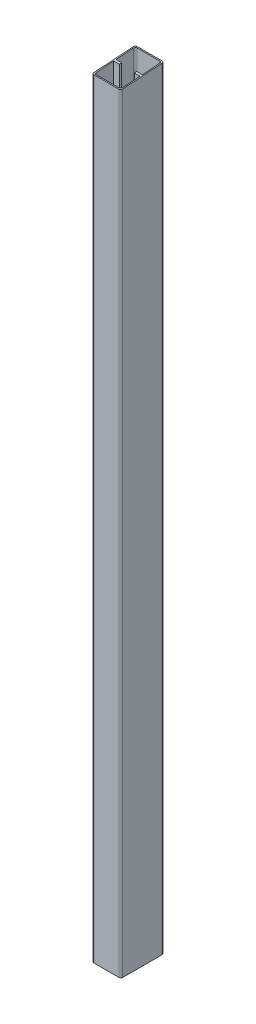
ISO-10303-21;
HEADER;
FILE_DESCRIPTION(('STEP AP214'),'2;1');
FILE_NAME('part.step','',(''),(''),'','','');
FILE_SCHEMA(('AUTOMOTIVE_DESIGN { 1 0 10303 214 1 1 1 1 }'));
ENDSEC;
DATA;
#1=APPLICATION_CONTEXT('core data for automotive mechanical design processes');
#2=APPLICATION_PROTOCOL_DEFINITION('international standard','automotive_design',2000,#1);
#3=PRODUCT_CONTEXT('',#1,'mechanical');
#4=PRODUCT('Part','Part','',(#3));
#5=PRODUCT_RELATED_PRODUCT_CATEGORY('part','',(#4));
#6=PRODUCT_DEFINITION_FORMATION('','',#4);
#7=PRODUCT_DEFINITION_CONTEXT('part definition',#1,'design');
#8=PRODUCT_DEFINITION('design','',#6,#7);
#9=PRODUCT_DEFINITION_SHAPE('','',#8);
#10=(LENGTH_UNIT() NAMED_UNIT(*) SI_UNIT(.MILLI.,.METRE.));
#11=(NAMED_UNIT(*) PLANE_ANGLE_UNIT() SI_UNIT($,.RADIAN.));
#12=(NAMED_UNIT(*) SI_UNIT($,.STERADIAN.) SOLID_ANGLE_UNIT());
#13=UNCERTAINTY_MEASURE_WITH_UNIT(LENGTH_MEASURE(1.E-05),#10,'distance_accuracy_value','');
#14=(GEOMETRIC_REPRESENTATION_CONTEXT(3) GLOBAL_UNCERTAINTY_ASSIGNED_CONTEXT((#13)) GLOBAL_UNIT_ASSIGNED_CONTEXT((#10,
#11,#12)) REPRESENTATION_CONTEXT('',''));
#15=CARTESIAN_POINT('',(0.,0.,0.));
#16=DIRECTION('',(0.,0.,1.));
#17=DIRECTION('',(1.,0.,0.));
#18=AXIS2_PLACEMENT_3D('',#15,#16,#17);
#19=CARTESIAN_POINT('',(-50.,2867.99923956296,75.));
#20=DIRECTION('',(0.,0.,-1.));
#21=DIRECTION('',(-1.,0.,0.));
#22=AXIS2_PLACEMENT_3D('',#19,#20,#21);
#23=PLANE('',#22);
#24=DIRECTION('',(1.,0.,0.));
#25=VECTOR('',#24,1.);
#26=CARTESIAN_POINT('',(-50.,0.,75.));
#27=LINE('',#26,#25);
#28=CARTESIAN_POINT('',(-44.,0.,75.));
#29=VERTEX_POINT('',#28);
#30=CARTESIAN_POINT('',(44.,0.,75.));
#31=VERTEX_POINT('',#30);
#32=EDGE_CURVE('E207',#29,#31,#27,.T.);
#33=ORIENTED_EDGE('',*,*,#32,.T.);
#34=DIRECTION('',(0.,-1.,0.));
#35=VECTOR('',#34,1.);
#36=CARTESIAN_POINT('',(44.,2867.99923956296,75.));
#37=LINE('',#36,#35);
#38=CARTESIAN_POINT('',(44.,2682.23684210526,75.));
#39=VERTEX_POINT('',#38);
#40=EDGE_CURVE('E283',#31,#39,#37,.F.);
#41=ORIENTED_EDGE('',*,*,#40,.T.);
#42=DIRECTION('',(1.,0.,0.));
#43=VECTOR('',#42,1.);
#44=CARTESIAN_POINT('',(-50.,2682.23684210526,75.));
#45=LINE('',#44,#43);
#46=CARTESIAN_POINT('',(-44.,2682.23684210526,75.));
#47=VERTEX_POINT('',#46);
#48=EDGE_CURVE('E340',#47,#39,#45,.T.);
#49=ORIENTED_EDGE('',*,*,#48,.F.);
#50=DIRECTION('',(0.,-1.,0.));
#51=VECTOR('',#50,1.);
#52=CARTESIAN_POINT('',(-44.,2867.99923956296,75.));
#53=LINE('',#52,#51);
#54=EDGE_CURVE('E280',#47,#29,#53,.T.);
#55=ORIENTED_EDGE('',*,*,#54,.T.);
#56=EDGE_LOOP('',(#33,#41,#49,#55));
#57=FACE_BOUND('',#56,.T.);
#58=ADVANCED_FACE('F33',(#57),#23,.F.);
#59=CARTESIAN_POINT('',(-50.,2867.99923956296,-75.));
#60=DIRECTION('',(1.,0.,0.));
#61=DIRECTION('',(0.,0.,-1.));
#62=AXIS2_PLACEMENT_3D('',#59,#60,#61);
#63=PLANE('',#62);
#64=DIRECTION('',(0.,-0.0700032814807309,0.997546761100416));
#65=VECTOR('',#64,1.);
#66=CARTESIAN_POINT('',(-50.,2693.62189520153,-87.2370066218541));
#67=LINE('',#66,#65);
#68=CARTESIAN_POINT('',(-50.,2692.34210526316,-68.9999999999999));
#69=VERTEX_POINT('',#68);
#70=CARTESIAN_POINT('',(-50.,2682.65789473684,69.));
#71=VERTEX_POINT('',#70);
#72=EDGE_CURVE('E342',#69,#71,#67,.T.);
#73=ORIENTED_EDGE('',*,*,#72,.F.);
#74=DIRECTION('',(0.,-1.,0.));
#75=VECTOR('',#74,1.);
#76=CARTESIAN_POINT('',(-50.,2867.99923956296,-69.));
#77=LINE('',#76,#75);
#78=CARTESIAN_POINT('',(-50.,0.,-69.));
#79=VERTEX_POINT('',#78);
#80=EDGE_CURVE('E253',#69,#79,#77,.T.);
#81=ORIENTED_EDGE('',*,*,#80,.T.);
#82=DIRECTION('',(0.,0.,1.));
#83=VECTOR('',#82,1.);
#84=CARTESIAN_POINT('',(-50.,0.,-75.));
#85=LINE('',#84,#83);
#86=CARTESIAN_POINT('',(-50.,0.,69.));
#87=VERTEX_POINT('',#86);
#88=EDGE_CURVE('E247',#79,#87,#85,.T.);
#89=ORIENTED_EDGE('',*,*,#88,.T.);
#90=DIRECTION('',(0.,-1.,0.));
#91=VECTOR('',#90,1.);
#92=CARTESIAN_POINT('',(-50.,2867.99923956296,69.));
#93=LINE('',#92,#91);
#94=EDGE_CURVE('E206',#87,#71,#93,.F.);
#95=ORIENTED_EDGE('',*,*,#94,.T.);
#96=EDGE_LOOP('',(#73,#81,#89,#95));
#97=FACE_BOUND('',#96,.T.);
#98=ADVANCED_FACE('F445',(#97),#63,.F.);
#99=CARTESIAN_POINT('',(-50.,2867.99923956296,-75.));
#100=DIRECTION('',(0.,0.,1.));
#101=DIRECTION('',(1.,0.,0.));
#102=AXIS2_PLACEMENT_3D('',#99,#100,#101);
#103=PLANE('',#102);
#104=DIRECTION('',(-1.,0.,0.));
#105=VECTOR('',#104,1.);
#106=CARTESIAN_POINT('',(-50.,0.,-75.));
#107=LINE('',#106,#105);
#108=CARTESIAN_POINT('',(44.,0.,-75.));
#109=VERTEX_POINT('',#108);
#110=CARTESIAN_POINT('',(-44.,0.,-75.));
#111=VERTEX_POINT('',#110);
#112=EDGE_CURVE('E244',#109,#111,#107,.T.);
#113=ORIENTED_EDGE('',*,*,#112,.T.);
#114=DIRECTION('',(0.,-1.,0.));
#115=VECTOR('',#114,1.);
#116=CARTESIAN_POINT('',(-44.,2867.99923956296,-75.));
#117=LINE('',#116,#115);
#118=CARTESIAN_POINT('',(-44.,2692.76315789474,-75.));
#119=VERTEX_POINT('',#118);
#120=EDGE_CURVE('E267',#111,#119,#117,.F.);
#121=ORIENTED_EDGE('',*,*,#120,.T.);
#122=DIRECTION('',(-1.,0.,0.));
#123=VECTOR('',#122,1.);
#124=CARTESIAN_POINT('',(-50.,2692.76315789474,-75.));
#125=LINE('',#124,#123);
#126=CARTESIAN_POINT('',(44.,2692.76315789474,-75.));
#127=VERTEX_POINT('',#126);
#128=EDGE_CURVE('E350',#127,#119,#125,.T.);
#129=ORIENTED_EDGE('',*,*,#128,.F.);
#130=DIRECTION('',(0.,-1.,0.));
#131=VECTOR('',#130,1.);
#132=CARTESIAN_POINT('',(44.,2867.99923956296,-75.));
#133=LINE('',#132,#131);
#134=EDGE_CURVE('E264',#127,#109,#133,.T.);
#135=ORIENTED_EDGE('',*,*,#134,.T.);
#136=EDGE_LOOP('',(#113,#121,#129,#135));
#137=FACE_BOUND('',#136,.T.);
#138=ADVANCED_FACE('F451',(#137),#103,.F.);
#139=CARTESIAN_POINT('',(50.,2867.99923956296,-75.));
#140=DIRECTION('',(-1.,0.,0.));
#141=DIRECTION('',(0.,0.,1.));
#142=AXIS2_PLACEMENT_3D('',#139,#140,#141);
#143=PLANE('',#142);
#144=DIRECTION('',(0.,0.0700032814807309,-0.997546761100416));
#145=VECTOR('',#144,1.);
#146=CARTESIAN_POINT('',(50.,2693.62189520153,-87.2370066218541));
#147=LINE('',#146,#145);
#148=CARTESIAN_POINT('',(50.,2682.65789473684,69.));
#149=VERTEX_POINT('',#148);
#150=CARTESIAN_POINT('',(50.,2692.34210526316,-68.9999999999999));
#151=VERTEX_POINT('',#150);
#152=EDGE_CURVE('E353',#149,#151,#147,.T.);
#153=ORIENTED_EDGE('',*,*,#152,.F.);
#154=DIRECTION('',(0.,-1.,0.));
#155=VECTOR('',#154,1.);
#156=CARTESIAN_POINT('',(50.,2867.99923956296,69.));
#157=LINE('',#156,#155);
#158=CARTESIAN_POINT('',(50.,0.,69.));
#159=VERTEX_POINT('',#158);
#160=EDGE_CURVE('E277',#149,#159,#157,.T.);
#161=ORIENTED_EDGE('',*,*,#160,.T.);
#162=DIRECTION('',(0.,0.,-1.));
#163=VECTOR('',#162,1.);
#164=CARTESIAN_POINT('',(50.,0.,-75.));
#165=LINE('',#164,#163);
#166=CARTESIAN_POINT('',(50.,0.,-69.));
#167=VERTEX_POINT('',#166);
#168=EDGE_CURVE('E242',#159,#167,#165,.T.);
#169=ORIENTED_EDGE('',*,*,#168,.T.);
#170=DIRECTION('',(0.,-1.,0.));
#171=VECTOR('',#170,1.);
#172=CARTESIAN_POINT('',(50.,2867.99923956296,-69.));
#173=LINE('',#172,#171);
#174=EDGE_CURVE('E48',#167,#151,#173,.F.);
#175=ORIENTED_EDGE('',*,*,#174,.T.);
#176=EDGE_LOOP('',(#153,#161,#169,#175));
#177=FACE_BOUND('',#176,.T.);
#178=ADVANCED_FACE('F459',(#177),#143,.F.);
#179=CARTESIAN_POINT('',(0.,0.,0.));
#180=DIRECTION('',(0.,1.,0.));
#181=DIRECTION('',(0.,0.,1.));
#182=AXIS2_PLACEMENT_3D('',#179,#180,#181);
#183=PLANE('',#182);
#184=ORIENTED_EDGE('',*,*,#88,.F.);
#185=CARTESIAN_POINT('',(-44.,0.,-69.));
#186=DIRECTION('',(0.,1.,0.));
#187=DIRECTION('',(0.,0.,1.));
#188=AXIS2_PLACEMENT_3D('',#185,#186,#187);
#189=CIRCLE('',#188,6.);
#190=EDGE_CURVE('E262',#79,#111,#189,.F.);
#191=ORIENTED_EDGE('',*,*,#190,.T.);
#192=ORIENTED_EDGE('',*,*,#112,.F.);
#193=CARTESIAN_POINT('',(44.,0.,-69.));
#194=DIRECTION('',(0.,1.,0.));
#195=DIRECTION('',(0.,0.,1.));
#196=AXIS2_PLACEMENT_3D('',#193,#194,#195);
#197=CIRCLE('',#196,6.);
#198=EDGE_CURVE('E258',#109,#167,#197,.F.);
#199=ORIENTED_EDGE('',*,*,#198,.T.);
#200=ORIENTED_EDGE('',*,*,#168,.F.);
#201=CARTESIAN_POINT('',(44.,0.,69.));
#202=DIRECTION('',(0.,1.,0.));
#203=DIRECTION('',(0.,0.,1.));
#204=AXIS2_PLACEMENT_3D('',#201,#202,#203);
#205=CIRCLE('',#204,6.);
#206=EDGE_CURVE('E260',#159,#31,#205,.F.);
#207=ORIENTED_EDGE('',*,*,#206,.T.);
#208=ORIENTED_EDGE('',*,*,#32,.F.);
#209=CARTESIAN_POINT('',(-44.,0.,69.));
#210=DIRECTION('',(0.,1.,0.));
#211=DIRECTION('',(0.,0.,1.));
#212=AXIS2_PLACEMENT_3D('',#209,#210,#211);
#213=CIRCLE('',#212,6.);
#214=EDGE_CURVE('E256',#29,#87,#213,.F.);
#215=ORIENTED_EDGE('',*,*,#214,.T.);
#216=EDGE_LOOP('',(#184,#191,#192,#199,#200,#207,#208,#215));
#217=FACE_BOUND('',#216,.T.);
#218=DIRECTION('',(0.,0.,-1.));
#219=VECTOR('',#218,1.);
#220=CARTESIAN_POINT('',(46.,0.,-71.));
#221=LINE('',#220,#219);
#222=CARTESIAN_POINT('',(46.,0.,-4.00000000000001));
#223=VERTEX_POINT('',#222);
#224=CARTESIAN_POINT('',(46.,0.,-65.));
#225=VERTEX_POINT('',#224);
#226=EDGE_CURVE('E220',#223,#225,#221,.T.);
#227=ORIENTED_EDGE('',*,*,#226,.T.);
#228=CARTESIAN_POINT('',(40.,0.,-65.));
#229=DIRECTION('',(0.,1.,0.));
#230=DIRECTION('',(0.,0.,1.));
#231=AXIS2_PLACEMENT_3D('',#228,#229,#230);
#232=CIRCLE('',#231,6.);
#233=CARTESIAN_POINT('',(40.,0.,-71.));
#234=VERTEX_POINT('',#233);
#235=EDGE_CURVE('E312',#225,#234,#232,.T.);
#236=ORIENTED_EDGE('',*,*,#235,.T.);
#237=DIRECTION('',(-1.,0.,0.));
#238=VECTOR('',#237,1.);
#239=CARTESIAN_POINT('',(-46.,0.,-71.));
#240=LINE('',#239,#238);
#241=CARTESIAN_POINT('',(-40.,0.,-71.));
#242=VERTEX_POINT('',#241);
#243=EDGE_CURVE('E321',#234,#242,#240,.T.);
#244=ORIENTED_EDGE('',*,*,#243,.T.);
#245=CARTESIAN_POINT('',(-40.,0.,-65.));
#246=DIRECTION('',(0.,1.,0.));
#247=DIRECTION('',(0.,0.,1.));
#248=AXIS2_PLACEMENT_3D('',#245,#246,#247);
#249=CIRCLE('',#248,6.);
#250=CARTESIAN_POINT('',(-46.,0.,-65.));
#251=VERTEX_POINT('',#250);
#252=EDGE_CURVE('E41',#242,#251,#249,.T.);
#253=ORIENTED_EDGE('',*,*,#252,.T.);
#254=DIRECTION('',(0.,0.,1.));
#255=VECTOR('',#254,1.);
#256=CARTESIAN_POINT('',(-46.,0.,-71.));
#257=LINE('',#256,#255);
#258=CARTESIAN_POINT('',(-46.,0.,-4.));
#259=VERTEX_POINT('',#258);
#260=EDGE_CURVE('E319',#251,#259,#257,.T.);
#261=ORIENTED_EDGE('',*,*,#260,.T.);
#262=DIRECTION('',(1.,0.,0.));
#263=VECTOR('',#262,1.);
#264=CARTESIAN_POINT('',(-46.,0.,-4.));
#265=LINE('',#264,#263);
#266=CARTESIAN_POINT('',(-26.,0.,-4.));
#267=VERTEX_POINT('',#266);
#268=EDGE_CURVE('E330',#259,#267,#265,.T.);
#269=ORIENTED_EDGE('',*,*,#268,.T.);
#270=DIRECTION('',(0.,0.,1.));
#271=VECTOR('',#270,1.);
#272=CARTESIAN_POINT('',(-26.,0.,-4.));
#273=LINE('',#272,#271);
#274=CARTESIAN_POINT('',(-26.,0.,4.));
#275=VERTEX_POINT('',#274);
#276=EDGE_CURVE('E357',#267,#275,#273,.T.);
#277=ORIENTED_EDGE('',*,*,#276,.T.);
#278=DIRECTION('',(-1.,0.,0.));
#279=VECTOR('',#278,1.);
#280=CARTESIAN_POINT('',(-46.,0.,4.));
#281=LINE('',#280,#279);
#282=CARTESIAN_POINT('',(-46.,0.,4.));
#283=VERTEX_POINT('',#282);
#284=EDGE_CURVE('E360',#275,#283,#281,.T.);
#285=ORIENTED_EDGE('',*,*,#284,.T.);
#286=DIRECTION('',(0.,0.,1.));
#287=VECTOR('',#286,1.);
#288=CARTESIAN_POINT('',(-46.,0.,4.));
#289=LINE('',#288,#287);
#290=CARTESIAN_POINT('',(-46.,0.,65.));
#291=VERTEX_POINT('',#290);
#292=EDGE_CURVE('E363',#283,#291,#289,.T.);
#293=ORIENTED_EDGE('',*,*,#292,.T.);
#294=CARTESIAN_POINT('',(-40.,0.,65.));
#295=DIRECTION('',(0.,1.,0.));
#296=DIRECTION('',(0.,0.,1.));
#297=AXIS2_PLACEMENT_3D('',#294,#295,#296);
#298=CIRCLE('',#297,6.);
#299=CARTESIAN_POINT('',(-40.,0.,71.));
#300=VERTEX_POINT('',#299);
#301=EDGE_CURVE('E308',#291,#300,#298,.T.);
#302=ORIENTED_EDGE('',*,*,#301,.T.);
#303=DIRECTION('',(1.,0.,0.));
#304=VECTOR('',#303,1.);
#305=CARTESIAN_POINT('',(-46.,0.,71.));
#306=LINE('',#305,#304);
#307=CARTESIAN_POINT('',(40.0000000000001,0.,71.));
#308=VERTEX_POINT('',#307);
#309=EDGE_CURVE('E366',#300,#308,#306,.T.);
#310=ORIENTED_EDGE('',*,*,#309,.T.);
#311=CARTESIAN_POINT('',(40.0000000000001,0.,65.));
#312=DIRECTION('',(0.,1.,0.));
#313=DIRECTION('',(0.,0.,1.));
#314=AXIS2_PLACEMENT_3D('',#311,#312,#313);
#315=CIRCLE('',#314,6.);
#316=CARTESIAN_POINT('',(46.,0.,65.));
#317=VERTEX_POINT('',#316);
#318=EDGE_CURVE('E304',#308,#317,#315,.T.);
#319=ORIENTED_EDGE('',*,*,#318,.T.);
#320=DIRECTION('',(0.,0.,-1.));
#321=VECTOR('',#320,1.);
#322=CARTESIAN_POINT('',(46.,0.,3.99999999999999));
#323=LINE('',#322,#321);
#324=CARTESIAN_POINT('',(46.,0.,3.99999999999999));
#325=VERTEX_POINT('',#324);
#326=EDGE_CURVE('E369',#317,#325,#323,.T.);
#327=ORIENTED_EDGE('',*,*,#326,.T.);
#328=DIRECTION('',(-1.,0.,0.));
#329=VECTOR('',#328,1.);
#330=CARTESIAN_POINT('',(46.,0.,3.99999999999999));
#331=LINE('',#330,#329);
#332=CARTESIAN_POINT('',(26.,0.,4.));
#333=VERTEX_POINT('',#332);
#334=EDGE_CURVE('E371',#325,#333,#331,.T.);
#335=ORIENTED_EDGE('',*,*,#334,.T.);
#336=DIRECTION('',(0.,0.,-1.));
#337=VECTOR('',#336,1.);
#338=CARTESIAN_POINT('',(26.,0.,-4.));
#339=LINE('',#338,#337);
#340=CARTESIAN_POINT('',(26.,0.,-4.));
#341=VERTEX_POINT('',#340);
#342=EDGE_CURVE('E374',#333,#341,#339,.T.);
#343=ORIENTED_EDGE('',*,*,#342,.T.);
#344=DIRECTION('',(1.,0.,0.));
#345=VECTOR('',#344,1.);
#346=CARTESIAN_POINT('',(46.,0.,-4.00000000000001));
#347=LINE('',#346,#345);
#348=EDGE_CURVE('E225',#341,#223,#347,.T.);
#349=ORIENTED_EDGE('',*,*,#348,.T.);
#350=EDGE_LOOP('',(#227,#236,#244,#253,#261,#269,#277,#285,#293,#302,#310,#319,#327,#335,#343,#349));
#351=FACE_BOUND('',#350,.T.);
#352=ADVANCED_FACE('F317',(#217,#351),#183,.F.);
#353=CARTESIAN_POINT('',(46.,2867.99923956296,-71.));
#354=DIRECTION('',(-1.,0.,0.));
#355=DIRECTION('',(0.,0.,1.));
#356=AXIS2_PLACEMENT_3D('',#353,#354,#355);
#357=PLANE('',#356);
#358=DIRECTION('',(0.,0.0700032814807309,-0.997546761100416));
#359=VECTOR('',#358,1.);
#360=CARTESIAN_POINT('',(46.,2693.3425690147,-83.2566084595264));
#361=LINE('',#360,#359);
#362=CARTESIAN_POINT('',(46.,2687.78070175439,-4.));
#363=VERTEX_POINT('',#362);
#364=CARTESIAN_POINT('',(46.,2692.06140350877,-65.));
#365=VERTEX_POINT('',#364);
#366=EDGE_CURVE('E194',#363,#365,#361,.T.);
#367=ORIENTED_EDGE('',*,*,#366,.T.);
#368=DIRECTION('',(0.,-1.,0.));
#369=VECTOR('',#368,1.);
#370=CARTESIAN_POINT('',(46.,0.,-65.));
#371=LINE('',#370,#369);
#372=EDGE_CURVE('E295',#365,#225,#371,.T.);
#373=ORIENTED_EDGE('',*,*,#372,.T.);
#374=ORIENTED_EDGE('',*,*,#226,.F.);
#375=DIRECTION('',(0.,-1.,0.));
#376=VECTOR('',#375,1.);
#377=CARTESIAN_POINT('',(46.,2867.99923956296,-4.00000000000001));
#378=LINE('',#377,#376);
#379=EDGE_CURVE('E212',#363,#223,#378,.T.);
#380=ORIENTED_EDGE('',*,*,#379,.F.);
#381=EDGE_LOOP('',(#367,#373,#374,#380));
#382=FACE_BOUND('',#381,.T.);
#383=ADVANCED_FACE('F218',(#382),#357,.T.);
#384=CARTESIAN_POINT('',(46.,2867.99923956296,-4.00000000000001));
#385=DIRECTION('',(0.,0.,-1.));
#386=DIRECTION('',(-1.,0.,0.));
#387=AXIS2_PLACEMENT_3D('',#384,#385,#386);
#388=PLANE('',#387);
#389=DIRECTION('',(0.,-1.,0.));
#390=VECTOR('',#389,1.);
#391=CARTESIAN_POINT('',(26.,2867.99923956296,-4.));
#392=LINE('',#391,#390);
#393=CARTESIAN_POINT('',(26.,2687.78070175439,-4.));
#394=VERTEX_POINT('',#393);
#395=EDGE_CURVE('E214',#394,#341,#392,.T.);
#396=ORIENTED_EDGE('',*,*,#395,.F.);
#397=DIRECTION('',(1.,0.,0.));
#398=VECTOR('',#397,1.);
#399=CARTESIAN_POINT('',(46.,2687.78070175439,-4.00000000000001));
#400=LINE('',#399,#398);
#401=EDGE_CURVE('E198',#394,#363,#400,.T.);
#402=ORIENTED_EDGE('',*,*,#401,.T.);
#403=ORIENTED_EDGE('',*,*,#379,.T.);
#404=ORIENTED_EDGE('',*,*,#348,.F.);
#405=EDGE_LOOP('',(#396,#402,#403,#404));
#406=FACE_BOUND('',#405,.T.);
#407=ADVANCED_FACE('F210',(#406),#388,.T.);
#408=CARTESIAN_POINT('',(26.,2867.99923956296,-4.));
#409=DIRECTION('',(-1.,0.,0.));
#410=DIRECTION('',(0.,0.,1.));
#411=AXIS2_PLACEMENT_3D('',#408,#409,#410);
#412=PLANE('',#411);
#413=DIRECTION('',(0.,-1.,0.));
#414=VECTOR('',#413,1.);
#415=CARTESIAN_POINT('',(26.,2867.99923956296,4.));
#416=LINE('',#415,#414);
#417=CARTESIAN_POINT('',(26.,2687.21929824561,4.));
#418=VERTEX_POINT('',#417);
#419=EDGE_CURVE('E223',#418,#333,#416,.T.);
#420=ORIENTED_EDGE('',*,*,#419,.F.);
#421=DIRECTION('',(0.,0.0700032814807309,-0.997546761100416));
#422=VECTOR('',#421,1.);
#423=CARTESIAN_POINT('',(26.,2688.6638553853,-16.5849392405372));
#424=LINE('',#423,#422);
#425=EDGE_CURVE('E216',#418,#394,#424,.T.);
#426=ORIENTED_EDGE('',*,*,#425,.T.);
#427=ORIENTED_EDGE('',*,*,#395,.T.);
#428=ORIENTED_EDGE('',*,*,#342,.F.);
#429=EDGE_LOOP('',(#420,#426,#427,#428));
#430=FACE_BOUND('',#429,.T.);
#431=ADVANCED_FACE('F380',(#430),#412,.T.);
#432=CARTESIAN_POINT('',(46.,2867.99923956296,3.99999999999999));
#433=DIRECTION('',(0.,0.,1.));
#434=DIRECTION('',(1.,0.,0.));
#435=AXIS2_PLACEMENT_3D('',#432,#433,#434);
#436=PLANE('',#435);
#437=DIRECTION('',(0.,-1.,0.));
#438=VECTOR('',#437,1.);
#439=CARTESIAN_POINT('',(46.,2867.99923956296,3.99999999999999));
#440=LINE('',#439,#438);
#441=CARTESIAN_POINT('',(46.,2687.21929824561,3.99999999999999));
#442=VERTEX_POINT('',#441);
#443=EDGE_CURVE('E230',#442,#325,#440,.T.);
#444=ORIENTED_EDGE('',*,*,#443,.F.);
#445=DIRECTION('',(-1.,0.,0.));
#446=VECTOR('',#445,1.);
#447=CARTESIAN_POINT('',(46.,2687.21929824561,3.99999999999999));
#448=LINE('',#447,#446);
#449=EDGE_CURVE('E383',#442,#418,#448,.T.);
#450=ORIENTED_EDGE('',*,*,#449,.T.);
#451=ORIENTED_EDGE('',*,*,#419,.T.);
#452=ORIENTED_EDGE('',*,*,#334,.F.);
#453=EDGE_LOOP('',(#444,#450,#451,#452));
#454=FACE_BOUND('',#453,.T.);
#455=ADVANCED_FACE('F435',(#454),#436,.T.);
#456=CARTESIAN_POINT('',(46.,2867.99923956296,3.99999999999999));
#457=DIRECTION('',(-1.,0.,0.));
#458=DIRECTION('',(0.,0.,1.));
#459=AXIS2_PLACEMENT_3D('',#456,#457,#458);
#460=PLANE('',#459);
#461=ORIENTED_EDGE('',*,*,#326,.F.);
#462=DIRECTION('',(0.,-1.,0.));
#463=VECTOR('',#462,1.);
#464=CARTESIAN_POINT('',(46.,2682.51754385965,65.));
#465=LINE('',#464,#463);
#466=CARTESIAN_POINT('',(46.,2682.93859649123,65.));
#467=VERTEX_POINT('',#466);
#468=EDGE_CURVE('E290',#317,#467,#465,.F.);
#469=ORIENTED_EDGE('',*,*,#468,.T.);
#470=DIRECTION('',(0.,0.0700032814807309,-0.997546761100416));
#471=VECTOR('',#470,1.);
#472=CARTESIAN_POINT('',(46.,2688.10520301164,-8.62414291588173));
#473=LINE('',#472,#471);
#474=EDGE_CURVE('E385',#467,#442,#473,.T.);
#475=ORIENTED_EDGE('',*,*,#474,.T.);
#476=ORIENTED_EDGE('',*,*,#443,.T.);
#477=EDGE_LOOP('',(#461,#469,#475,#476));
#478=FACE_BOUND('',#477,.T.);
#479=ADVANCED_FACE('F431',(#478),#460,.T.);
#480=CARTESIAN_POINT('',(-46.,2867.99923956296,71.));
#481=DIRECTION('',(0.,0.,-1.));
#482=DIRECTION('',(-1.,0.,0.));
#483=AXIS2_PLACEMENT_3D('',#480,#481,#482);
#484=PLANE('',#483);
#485=DIRECTION('',(1.,0.,0.));
#486=VECTOR('',#485,1.);
#487=CARTESIAN_POINT('',(-46.,2682.51754385965,71.));
#488=LINE('',#487,#486);
#489=CARTESIAN_POINT('',(-40.,2682.51754385965,71.));
#490=VERTEX_POINT('',#489);
#491=CARTESIAN_POINT('',(40.0000000000001,2682.51754385965,71.));
#492=VERTEX_POINT('',#491);
#493=EDGE_CURVE('E389',#490,#492,#488,.T.);
#494=ORIENTED_EDGE('',*,*,#493,.T.);
#495=DIRECTION('',(0.,-1.,0.));
#496=VECTOR('',#495,1.);
#497=CARTESIAN_POINT('',(40.0000000000001,0.,71.));
#498=LINE('',#497,#496);
#499=EDGE_CURVE('E287',#492,#308,#498,.T.);
#500=ORIENTED_EDGE('',*,*,#499,.T.);
#501=ORIENTED_EDGE('',*,*,#309,.F.);
#502=DIRECTION('',(0.,-1.,0.));
#503=VECTOR('',#502,1.);
#504=CARTESIAN_POINT('',(-40.,2682.51754385965,71.));
#505=LINE('',#504,#503);
#506=EDGE_CURVE('E285',#300,#490,#505,.F.);
#507=ORIENTED_EDGE('',*,*,#506,.T.);
#508=EDGE_LOOP('',(#494,#500,#501,#507));
#509=FACE_BOUND('',#508,.T.);
#510=ADVANCED_FACE('F422',(#509),#484,.T.);
#511=CARTESIAN_POINT('',(-46.,2867.99923956296,4.));
#512=DIRECTION('',(1.,0.,0.));
#513=DIRECTION('',(0.,0.,-1.));
#514=AXIS2_PLACEMENT_3D('',#511,#512,#513);
#515=PLANE('',#514);
#516=DIRECTION('',(0.,-0.0700032814807309,0.997546761100416));
#517=VECTOR('',#516,1.);
#518=CARTESIAN_POINT('',(-46.,2688.10520301164,-8.62414291588172));
#519=LINE('',#518,#517);
#520=CARTESIAN_POINT('',(-46.,2687.21929824561,4.));
#521=VERTEX_POINT('',#520);
#522=CARTESIAN_POINT('',(-46.,2682.93859649123,65.));
#523=VERTEX_POINT('',#522);
#524=EDGE_CURVE('E392',#521,#523,#519,.T.);
#525=ORIENTED_EDGE('',*,*,#524,.T.);
#526=DIRECTION('',(0.,-1.,0.));
#527=VECTOR('',#526,1.);
#528=CARTESIAN_POINT('',(-46.,0.,65.));
#529=LINE('',#528,#527);
#530=EDGE_CURVE('E292',#523,#291,#529,.T.);
#531=ORIENTED_EDGE('',*,*,#530,.T.);
#532=ORIENTED_EDGE('',*,*,#292,.F.);
#533=DIRECTION('',(0.,-1.,0.));
#534=VECTOR('',#533,1.);
#535=CARTESIAN_POINT('',(-46.,2867.99923956296,4.));
#536=LINE('',#535,#534);
#537=EDGE_CURVE('E233',#521,#283,#536,.T.);
#538=ORIENTED_EDGE('',*,*,#537,.F.);
#539=EDGE_LOOP('',(#525,#531,#532,#538));
#540=FACE_BOUND('',#539,.T.);
#541=ADVANCED_FACE('F414',(#540),#515,.T.);
#542=CARTESIAN_POINT('',(-46.,2867.99923956296,4.));
#543=DIRECTION('',(0.,0.,1.));
#544=DIRECTION('',(1.,0.,0.));
#545=AXIS2_PLACEMENT_3D('',#542,#543,#544);
#546=PLANE('',#545);
#547=DIRECTION('',(0.,-1.,0.));
#548=VECTOR('',#547,1.);
#549=CARTESIAN_POINT('',(-26.,2867.99923956296,4.));
#550=LINE('',#549,#548);
#551=CARTESIAN_POINT('',(-26.,2687.21929824561,4.));
#552=VERTEX_POINT('',#551);
#553=EDGE_CURVE('E235',#552,#275,#550,.T.);
#554=ORIENTED_EDGE('',*,*,#553,.F.);
#555=DIRECTION('',(-1.,0.,0.));
#556=VECTOR('',#555,1.);
#557=CARTESIAN_POINT('',(-46.,2687.21929824561,4.));
#558=LINE('',#557,#556);
#559=EDGE_CURVE('E395',#552,#521,#558,.T.);
#560=ORIENTED_EDGE('',*,*,#559,.T.);
#561=ORIENTED_EDGE('',*,*,#537,.T.);
#562=ORIENTED_EDGE('',*,*,#284,.F.);
#563=EDGE_LOOP('',(#554,#560,#561,#562));
#564=FACE_BOUND('',#563,.T.);
#565=ADVANCED_FACE('F411',(#564),#546,.T.);
#566=CARTESIAN_POINT('',(-26.,2867.99923956296,-4.));
#567=DIRECTION('',(1.,0.,0.));
#568=DIRECTION('',(0.,0.,-1.));
#569=AXIS2_PLACEMENT_3D('',#566,#567,#568);
#570=PLANE('',#569);
#571=DIRECTION('',(0.,-1.,0.));
#572=VECTOR('',#571,1.);
#573=CARTESIAN_POINT('',(-26.,2867.99923956296,-4.));
#574=LINE('',#573,#572);
#575=CARTESIAN_POINT('',(-26.,2687.78070175439,-4.));
#576=VERTEX_POINT('',#575);
#577=EDGE_CURVE('E237',#576,#267,#574,.T.);
#578=ORIENTED_EDGE('',*,*,#577,.F.);
#579=DIRECTION('',(0.,-0.0700032814807309,0.997546761100416));
#580=VECTOR('',#579,1.);
#581=CARTESIAN_POINT('',(-26.,2688.6638553853,-16.5849392405372));
#582=LINE('',#581,#580);
#583=EDGE_CURVE('E398',#576,#552,#582,.T.);
#584=ORIENTED_EDGE('',*,*,#583,.T.);
#585=ORIENTED_EDGE('',*,*,#553,.T.);
#586=ORIENTED_EDGE('',*,*,#276,.F.);
#587=EDGE_LOOP('',(#578,#584,#585,#586));
#588=FACE_BOUND('',#587,.T.);
#589=ADVANCED_FACE('F407',(#588),#570,.T.);
#590=CARTESIAN_POINT('',(-46.,2867.99923956296,-4.));
#591=DIRECTION('',(0.,0.,-1.));
#592=DIRECTION('',(-1.,0.,0.));
#593=AXIS2_PLACEMENT_3D('',#590,#591,#592);
#594=PLANE('',#593);
#595=DIRECTION('',(0.,-1.,0.));
#596=VECTOR('',#595,1.);
#597=CARTESIAN_POINT('',(-46.,2867.99923956296,-4.));
#598=LINE('',#597,#596);
#599=CARTESIAN_POINT('',(-46.,2687.78070175439,-4.));
#600=VERTEX_POINT('',#599);
#601=EDGE_CURVE('E239',#600,#259,#598,.T.);
#602=ORIENTED_EDGE('',*,*,#601,.F.);
#603=DIRECTION('',(1.,0.,0.));
#604=VECTOR('',#603,1.);
#605=CARTESIAN_POINT('',(-46.,2687.78070175439,-4.));
#606=LINE('',#605,#604);
#607=EDGE_CURVE('E344',#600,#576,#606,.T.);
#608=ORIENTED_EDGE('',*,*,#607,.T.);
#609=ORIENTED_EDGE('',*,*,#577,.T.);
#610=ORIENTED_EDGE('',*,*,#268,.F.);
#611=EDGE_LOOP('',(#602,#608,#609,#610));
#612=FACE_BOUND('',#611,.T.);
#613=ADVANCED_FACE('F402',(#612),#594,.T.);
#614=CARTESIAN_POINT('',(-46.,2867.99923956296,-71.));
#615=DIRECTION('',(1.,0.,0.));
#616=DIRECTION('',(0.,0.,-1.));
#617=AXIS2_PLACEMENT_3D('',#614,#615,#616);
#618=PLANE('',#617);
#619=ORIENTED_EDGE('',*,*,#260,.F.);
#620=DIRECTION('',(0.,-1.,0.));
#621=VECTOR('',#620,1.);
#622=CARTESIAN_POINT('',(-46.,2692.48245614035,-65.));
#623=LINE('',#622,#621);
#624=CARTESIAN_POINT('',(-46.,2692.06140350877,-65.));
#625=VERTEX_POINT('',#624);
#626=EDGE_CURVE('E302',#251,#625,#623,.F.);
#627=ORIENTED_EDGE('',*,*,#626,.T.);
#628=DIRECTION('',(0.,-0.0700032814807309,0.997546761100416));
#629=VECTOR('',#628,1.);
#630=CARTESIAN_POINT('',(-46.,2693.3425690147,-83.2566084595264));
#631=LINE('',#630,#629);
#632=EDGE_CURVE('E336',#625,#600,#631,.T.);
#633=ORIENTED_EDGE('',*,*,#632,.T.);
#634=ORIENTED_EDGE('',*,*,#601,.T.);
#635=EDGE_LOOP('',(#619,#627,#633,#634));
#636=FACE_BOUND('',#635,.T.);
#637=ADVANCED_FACE('F326',(#636),#618,.T.);
#638=CARTESIAN_POINT('',(-46.,2867.99923956296,-71.));
#639=DIRECTION('',(0.,0.,1.));
#640=DIRECTION('',(1.,0.,0.));
#641=AXIS2_PLACEMENT_3D('',#638,#639,#640);
#642=PLANE('',#641);
#643=ORIENTED_EDGE('',*,*,#243,.F.);
#644=DIRECTION('',(0.,-1.,0.));
#645=VECTOR('',#644,1.);
#646=CARTESIAN_POINT('',(40.,2692.48245614035,-71.));
#647=LINE('',#646,#645);
#648=CARTESIAN_POINT('',(40.,2692.48245614035,-71.));
#649=VERTEX_POINT('',#648);
#650=EDGE_CURVE('E300',#234,#649,#647,.F.);
#651=ORIENTED_EDGE('',*,*,#650,.T.);
#652=DIRECTION('',(-1.,0.,0.));
#653=VECTOR('',#652,1.);
#654=CARTESIAN_POINT('',(-46.,2692.48245614035,-71.));
#655=LINE('',#654,#653);
#656=CARTESIAN_POINT('',(-40.,2692.48245614035,-71.));
#657=VERTEX_POINT('',#656);
#658=EDGE_CURVE('E334',#649,#657,#655,.T.);
#659=ORIENTED_EDGE('',*,*,#658,.T.);
#660=DIRECTION('',(0.,-1.,0.));
#661=VECTOR('',#660,1.);
#662=CARTESIAN_POINT('',(-40.,0.,-71.));
#663=LINE('',#662,#661);
#664=EDGE_CURVE('E297',#657,#242,#663,.T.);
#665=ORIENTED_EDGE('',*,*,#664,.T.);
#666=EDGE_LOOP('',(#643,#651,#659,#665));
#667=FACE_BOUND('',#666,.T.);
#668=ADVANCED_FACE('F338',(#667),#642,.T.);
#669=CARTESIAN_POINT('',(-30.0000000000014,2677.49015555781,142.640283301246));
#670=DIRECTION('',(0.,0.997546761100416,0.0700032814807309));
#671=DIRECTION('',(-1.,0.,0.));
#672=AXIS2_PLACEMENT_3D('',#669,#670,#671);
#673=PLANE('',#672);
#674=ORIENTED_EDGE('',*,*,#658,.F.);
#675=CARTESIAN_POINT('',(40.,2692.06140350877,-65.));
#676=DIRECTION('',(0.,0.997546761100416,0.0700032814807309));
#677=DIRECTION('',(0.,0.0700032814807309,-0.997546761100416));
#678=AXIS2_PLACEMENT_3D('',#675,#676,#677);
#679=ELLIPSE('',#678,6.01475563248912,6.);
#680=EDGE_CURVE('E201',#649,#365,#679,.F.);
#681=ORIENTED_EDGE('',*,*,#680,.T.);
#682=ORIENTED_EDGE('',*,*,#366,.F.);
#683=ORIENTED_EDGE('',*,*,#401,.F.);
#684=ORIENTED_EDGE('',*,*,#425,.F.);
#685=ORIENTED_EDGE('',*,*,#449,.F.);
#686=ORIENTED_EDGE('',*,*,#474,.F.);
#687=CARTESIAN_POINT('',(40.0000000000001,2682.93859649123,65.));
#688=DIRECTION('',(0.,0.997546761100416,0.0700032814807309));
#689=DIRECTION('',(0.,0.0700032814807309,-0.997546761100416));
#690=AXIS2_PLACEMENT_3D('',#687,#688,#689);
#691=ELLIPSE('',#690,6.01475563248912,6.);
#692=EDGE_CURVE('E306',#467,#492,#691,.F.);
#693=ORIENTED_EDGE('',*,*,#692,.T.);
#694=ORIENTED_EDGE('',*,*,#493,.F.);
#695=CARTESIAN_POINT('',(-40.,2682.93859649123,65.));
#696=DIRECTION('',(0.,0.997546761100416,0.0700032814807309));
#697=DIRECTION('',(0.,0.0700032814807309,-0.997546761100416));
#698=AXIS2_PLACEMENT_3D('',#695,#696,#697);
#699=ELLIPSE('',#698,6.01475563248912,6.);
#700=EDGE_CURVE('E310',#490,#523,#699,.F.);
#701=ORIENTED_EDGE('',*,*,#700,.T.);
#702=ORIENTED_EDGE('',*,*,#524,.F.);
#703=ORIENTED_EDGE('',*,*,#559,.F.);
#704=ORIENTED_EDGE('',*,*,#583,.F.);
#705=ORIENTED_EDGE('',*,*,#607,.F.);
#706=ORIENTED_EDGE('',*,*,#632,.F.);
#707=CARTESIAN_POINT('',(-40.,2692.06140350877,-65.));
#708=DIRECTION('',(0.,0.997546761100416,0.0700032814807309));
#709=DIRECTION('',(0.,0.0700032814807309,-0.997546761100416));
#710=AXIS2_PLACEMENT_3D('',#707,#708,#709);
#711=ELLIPSE('',#710,6.01475563248912,6.);
#712=EDGE_CURVE('E11',#625,#657,#711,.F.);
#713=ORIENTED_EDGE('',*,*,#712,.T.);
#714=EDGE_LOOP('',(#674,#681,#682,#683,#684,#685,#686,#693,#694,#701,#702,#703,#704,#705,#706,#713));
#715=FACE_BOUND('',#714,.T.);
#716=ORIENTED_EDGE('',*,*,#128,.T.);
#717=CARTESIAN_POINT('',(-44.,2692.34210526316,-69.));
#718=DIRECTION('',(0.,0.997546761100416,0.0700032814807309));
#719=DIRECTION('',(0.,-0.0700032814807309,0.997546761100416));
#720=AXIS2_PLACEMENT_3D('',#717,#718,#719);
#721=ELLIPSE('',#720,6.01475563248912,6.);
#722=EDGE_CURVE('E274',#119,#69,#721,.T.);
#723=ORIENTED_EDGE('',*,*,#722,.T.);
#724=ORIENTED_EDGE('',*,*,#72,.T.);
#725=CARTESIAN_POINT('',(-44.,2682.65789473684,69.));
#726=DIRECTION('',(0.,0.997546761100416,0.0700032814807309));
#727=DIRECTION('',(0.,-0.0700032814807309,0.997546761100416));
#728=AXIS2_PLACEMENT_3D('',#725,#726,#727);
#729=ELLIPSE('',#728,6.01475563248912,6.);
#730=EDGE_CURVE('E269',#71,#47,#729,.T.);
#731=ORIENTED_EDGE('',*,*,#730,.T.);
#732=ORIENTED_EDGE('',*,*,#48,.T.);
#733=CARTESIAN_POINT('',(44.,2682.65789473684,69.));
#734=DIRECTION('',(0.,0.997546761100416,0.0700032814807309));
#735=DIRECTION('',(0.,-0.0700032814807309,0.997546761100416));
#736=AXIS2_PLACEMENT_3D('',#733,#734,#735);
#737=ELLIPSE('',#736,6.01475563248912,6.);
#738=EDGE_CURVE('E55',#39,#149,#737,.T.);
#739=ORIENTED_EDGE('',*,*,#738,.T.);
#740=ORIENTED_EDGE('',*,*,#152,.T.);
#741=CARTESIAN_POINT('',(44.,2692.34210526316,-69.));
#742=DIRECTION('',(0.,0.997546761100416,0.0700032814807309));
#743=DIRECTION('',(0.,-0.0700032814807309,0.997546761100416));
#744=AXIS2_PLACEMENT_3D('',#741,#742,#743);
#745=ELLIPSE('',#744,6.01475563248912,6.);
#746=EDGE_CURVE('E271',#151,#127,#745,.T.);
#747=ORIENTED_EDGE('',*,*,#746,.T.);
#748=EDGE_LOOP('',(#716,#723,#724,#731,#732,#739,#740,#747));
#749=FACE_BOUND('',#748,.T.);
#750=ADVANCED_FACE('F197',(#715,#749),#673,.T.);
#751=CARTESIAN_POINT('',(-44.,2867.99923956296,-69.));
#752=DIRECTION('',(0.,-1.,0.));
#753=DIRECTION('',(0.,0.,-1.));
#754=AXIS2_PLACEMENT_3D('',#751,#752,#753);
#755=CYLINDRICAL_SURFACE('',#754,6.);
#756=ORIENTED_EDGE('',*,*,#722,.F.);
#757=ORIENTED_EDGE('',*,*,#120,.F.);
#758=ORIENTED_EDGE('',*,*,#190,.F.);
#759=ORIENTED_EDGE('',*,*,#80,.F.);
#760=EDGE_LOOP('',(#756,#757,#758,#759));
#761=FACE_BOUND('',#760,.T.);
#762=ADVANCED_FACE('F463',(#761),#755,.T.);
#763=CARTESIAN_POINT('',(44.,2867.99923956296,69.));
#764=DIRECTION('',(0.,-1.,0.));
#765=DIRECTION('',(0.,0.,-1.));
#766=AXIS2_PLACEMENT_3D('',#763,#764,#765);
#767=CYLINDRICAL_SURFACE('',#766,6.);
#768=ORIENTED_EDGE('',*,*,#738,.F.);
#769=ORIENTED_EDGE('',*,*,#40,.F.);
#770=ORIENTED_EDGE('',*,*,#206,.F.);
#771=ORIENTED_EDGE('',*,*,#160,.F.);
#772=EDGE_LOOP('',(#768,#769,#770,#771));
#773=FACE_BOUND('',#772,.T.);
#774=ADVANCED_FACE('F466',(#773),#767,.T.);
#775=CARTESIAN_POINT('',(40.0000000000001,2867.99923956296,65.));
#776=DIRECTION('',(0.,1.,0.));
#777=DIRECTION('',(0.,0.,1.));
#778=AXIS2_PLACEMENT_3D('',#775,#776,#777);
#779=CYLINDRICAL_SURFACE('',#778,6.);
#780=ORIENTED_EDGE('',*,*,#692,.F.);
#781=ORIENTED_EDGE('',*,*,#468,.F.);
#782=ORIENTED_EDGE('',*,*,#318,.F.);
#783=ORIENTED_EDGE('',*,*,#499,.F.);
#784=EDGE_LOOP('',(#780,#781,#782,#783));
#785=FACE_BOUND('',#784,.T.);
#786=ADVANCED_FACE('F427',(#785),#779,.F.);
#787=CARTESIAN_POINT('',(-40.,2867.99923956296,65.));
#788=DIRECTION('',(0.,1.,0.));
#789=DIRECTION('',(0.,0.,1.));
#790=AXIS2_PLACEMENT_3D('',#787,#788,#789);
#791=CYLINDRICAL_SURFACE('',#790,6.);
#792=ORIENTED_EDGE('',*,*,#700,.F.);
#793=ORIENTED_EDGE('',*,*,#506,.F.);
#794=ORIENTED_EDGE('',*,*,#301,.F.);
#795=ORIENTED_EDGE('',*,*,#530,.F.);
#796=EDGE_LOOP('',(#792,#793,#794,#795));
#797=FACE_BOUND('',#796,.T.);
#798=ADVANCED_FACE('F418',(#797),#791,.F.);
#799=CARTESIAN_POINT('',(40.,2867.99923956296,-65.));
#800=DIRECTION('',(0.,1.,0.));
#801=DIRECTION('',(0.,0.,1.));
#802=AXIS2_PLACEMENT_3D('',#799,#800,#801);
#803=CYLINDRICAL_SURFACE('',#802,6.);
#804=ORIENTED_EDGE('',*,*,#680,.F.);
#805=ORIENTED_EDGE('',*,*,#650,.F.);
#806=ORIENTED_EDGE('',*,*,#235,.F.);
#807=ORIENTED_EDGE('',*,*,#372,.F.);
#808=EDGE_LOOP('',(#804,#805,#806,#807));
#809=FACE_BOUND('',#808,.T.);
#810=ADVANCED_FACE('F475',(#809),#803,.F.);
#811=CARTESIAN_POINT('',(44.,2867.99923956296,-69.));
#812=DIRECTION('',(0.,-1.,0.));
#813=DIRECTION('',(0.,0.,-1.));
#814=AXIS2_PLACEMENT_3D('',#811,#812,#813);
#815=CYLINDRICAL_SURFACE('',#814,6.);
#816=ORIENTED_EDGE('',*,*,#746,.F.);
#817=ORIENTED_EDGE('',*,*,#174,.F.);
#818=ORIENTED_EDGE('',*,*,#198,.F.);
#819=ORIENTED_EDGE('',*,*,#134,.F.);
#820=EDGE_LOOP('',(#816,#817,#818,#819));
#821=FACE_BOUND('',#820,.T.);
#822=ADVANCED_FACE('F478',(#821),#815,.T.);
#823=CARTESIAN_POINT('',(-44.,2867.99923956296,69.));
#824=DIRECTION('',(0.,-1.,0.));
#825=DIRECTION('',(0.,0.,-1.));
#826=AXIS2_PLACEMENT_3D('',#823,#824,#825);
#827=CYLINDRICAL_SURFACE('',#826,6.);
#828=ORIENTED_EDGE('',*,*,#730,.F.);
#829=ORIENTED_EDGE('',*,*,#94,.F.);
#830=ORIENTED_EDGE('',*,*,#214,.F.);
#831=ORIENTED_EDGE('',*,*,#54,.F.);
#832=EDGE_LOOP('',(#828,#829,#830,#831));
#833=FACE_BOUND('',#832,.T.);
#834=ADVANCED_FACE('F481',(#833),#827,.T.);
#835=CARTESIAN_POINT('',(-40.,2867.99923956296,-65.));
#836=DIRECTION('',(0.,1.,0.));
#837=DIRECTION('',(0.,0.,1.));
#838=AXIS2_PLACEMENT_3D('',#835,#836,#837);
#839=CYLINDRICAL_SURFACE('',#838,6.);
#840=ORIENTED_EDGE('',*,*,#712,.F.);
#841=ORIENTED_EDGE('',*,*,#626,.F.);
#842=ORIENTED_EDGE('',*,*,#252,.F.);
#843=ORIENTED_EDGE('',*,*,#664,.F.);
#844=EDGE_LOOP('',(#840,#841,#842,#843));
#845=FACE_BOUND('',#844,.T.);
#846=ADVANCED_FACE('F35',(#845),#839,.F.);
#847=CLOSED_SHELL('',(#58,#98,#138,#178,#352,#383,#407,#431,#455,#479,#510,#541,#565,#589,#613,
#637,#668,#750,#762,#774,#786,#798,#810,#822,#834,#846));
#848=MANIFOLD_SOLID_BREP('B2',#847);
#849=ADVANCED_BREP_SHAPE_REPRESENTATION('',(#18,#848),#14);
#850=SHAPE_DEFINITION_REPRESENTATION(#9,#849);
ENDSEC;
END-ISO-10303-21;
